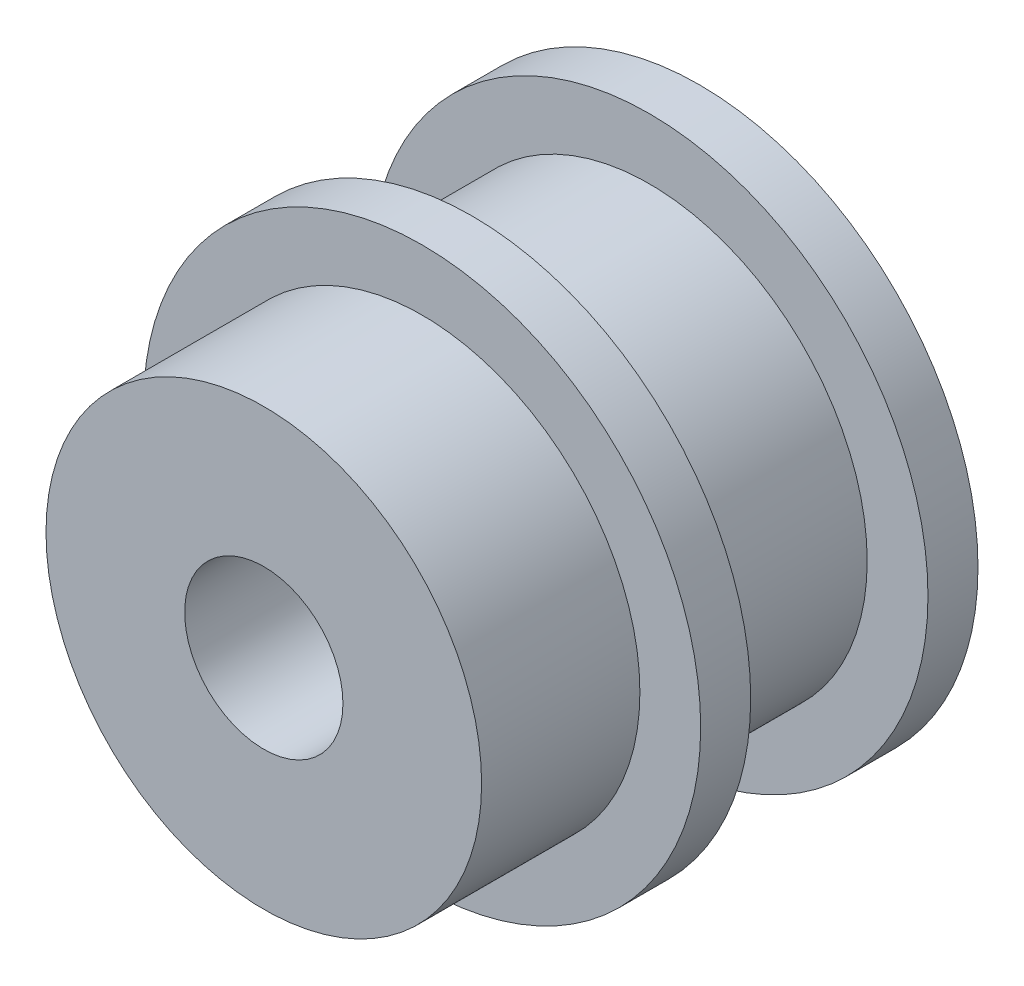
ISO-10303-21;
HEADER;
FILE_DESCRIPTION(('STEP AP214'),'2;1');
FILE_NAME('part.step','',(''),(''),'','','');
FILE_SCHEMA(('AUTOMOTIVE_DESIGN { 1 0 10303 214 1 1 1 1 }'));
ENDSEC;
DATA;
#1=APPLICATION_CONTEXT('core data for automotive mechanical design processes');
#2=APPLICATION_PROTOCOL_DEFINITION('international standard','automotive_design',2000,#1);
#3=PRODUCT_CONTEXT('',#1,'mechanical');
#4=PRODUCT('Part','Part','',(#3));
#5=PRODUCT_RELATED_PRODUCT_CATEGORY('part','',(#4));
#6=PRODUCT_DEFINITION_FORMATION('','',#4);
#7=PRODUCT_DEFINITION_CONTEXT('part definition',#1,'design');
#8=PRODUCT_DEFINITION('design','',#6,#7);
#9=PRODUCT_DEFINITION_SHAPE('','',#8);
#10=(LENGTH_UNIT() NAMED_UNIT(*) SI_UNIT(.MILLI.,.METRE.));
#11=(NAMED_UNIT(*) PLANE_ANGLE_UNIT() SI_UNIT($,.RADIAN.));
#12=(NAMED_UNIT(*) SI_UNIT($,.STERADIAN.) SOLID_ANGLE_UNIT());
#13=UNCERTAINTY_MEASURE_WITH_UNIT(LENGTH_MEASURE(1.E-05),#10,'distance_accuracy_value','');
#14=(GEOMETRIC_REPRESENTATION_CONTEXT(3) GLOBAL_UNCERTAINTY_ASSIGNED_CONTEXT((#13)) GLOBAL_UNIT_ASSIGNED_CONTEXT((#10,
#11,#12)) REPRESENTATION_CONTEXT('',''));
#15=CARTESIAN_POINT('',(0.,0.,0.));
#16=DIRECTION('',(0.,0.,1.));
#17=DIRECTION('',(1.,0.,0.));
#18=AXIS2_PLACEMENT_3D('',#15,#16,#17);
#19=CARTESIAN_POINT('',(0.,0.,0.));
#20=DIRECTION('',(0.,0.,1.));
#21=DIRECTION('',(1.,0.,0.));
#22=AXIS2_PLACEMENT_3D('',#19,#20,#21);
#23=PLANE('',#22);
#24=CARTESIAN_POINT('',(0.,0.,0.));
#25=DIRECTION('',(0.,0.,1.));
#26=DIRECTION('',(1.,0.,0.));
#27=AXIS2_PLACEMENT_3D('',#24,#25,#26);
#28=CIRCLE('',#27,8.7376);
#29=CARTESIAN_POINT('',(8.7376,0.,0.));
#30=VERTEX_POINT('',#29);
#31=EDGE_CURVE('E65',#30,#30,#28,.T.);
#32=ORIENTED_EDGE('',*,*,#31,.T.);
#33=EDGE_LOOP('',(#32));
#34=FACE_BOUND('',#33,.T.);
#35=CARTESIAN_POINT('',(0.,0.,0.));
#36=DIRECTION('',(0.,0.,1.));
#37=DIRECTION('',(1.,0.,0.));
#38=AXIS2_PLACEMENT_3D('',#35,#36,#37);
#39=CIRCLE('',#38,3.175);
#40=CARTESIAN_POINT('',(3.175,0.,0.));
#41=VERTEX_POINT('',#40);
#42=EDGE_CURVE('E10',#41,#41,#39,.T.);
#43=ORIENTED_EDGE('',*,*,#42,.F.);
#44=EDGE_LOOP('',(#43));
#45=FACE_BOUND('',#44,.T.);
#46=ADVANCED_FACE('F31',(#34,#45),#23,.T.);
#47=CARTESIAN_POINT('',(0.,0.,0.));
#48=DIRECTION('',(0.,0.,1.));
#49=DIRECTION('',(1.,0.,0.));
#50=AXIS2_PLACEMENT_3D('',#47,#48,#49);
#51=CYLINDRICAL_SURFACE('',#50,3.175);
#52=CARTESIAN_POINT('',(0.,0.,-17.4752));
#53=DIRECTION('',(0.,0.,1.));
#54=DIRECTION('',(1.,0.,0.));
#55=AXIS2_PLACEMENT_3D('',#52,#53,#54);
#56=CIRCLE('',#55,3.175);
#57=CARTESIAN_POINT('',(3.175,0.,-17.4752));
#58=VERTEX_POINT('',#57);
#59=EDGE_CURVE('E37',#58,#58,#56,.T.);
#60=ORIENTED_EDGE('',*,*,#59,.F.);
#61=EDGE_LOOP('',(#60));
#62=FACE_BOUND('',#61,.T.);
#63=ORIENTED_EDGE('',*,*,#42,.T.);
#64=EDGE_LOOP('',(#63));
#65=FACE_BOUND('',#64,.T.);
#66=ADVANCED_FACE('F83',(#62,#65),#51,.F.);
#67=CARTESIAN_POINT('',(0.,0.,-17.4752));
#68=DIRECTION('',(0.,0.,-1.));
#69=DIRECTION('',(-1.,0.,0.));
#70=AXIS2_PLACEMENT_3D('',#67,#68,#69);
#71=PLANE('',#70);
#72=ORIENTED_EDGE('',*,*,#59,.T.);
#73=EDGE_LOOP('',(#72));
#74=FACE_BOUND('',#73,.T.);
#75=CARTESIAN_POINT('',(0.,0.,-17.4752));
#76=DIRECTION('',(0.,0.,1.));
#77=DIRECTION('',(1.,0.,0.));
#78=AXIS2_PLACEMENT_3D('',#75,#76,#77);
#79=CIRCLE('',#78,11.176);
#80=CARTESIAN_POINT('',(11.176,0.,-17.4752));
#81=VERTEX_POINT('',#80);
#82=EDGE_CURVE('E41',#81,#81,#79,.T.);
#83=ORIENTED_EDGE('',*,*,#82,.F.);
#84=EDGE_LOOP('',(#83));
#85=FACE_BOUND('',#84,.T.);
#86=ADVANCED_FACE('F87',(#74,#85),#71,.T.);
#87=CARTESIAN_POINT('',(0.,0.,0.));
#88=DIRECTION('',(0.,0.,1.));
#89=DIRECTION('',(1.,0.,0.));
#90=AXIS2_PLACEMENT_3D('',#87,#88,#89);
#91=CYLINDRICAL_SURFACE('',#90,11.176);
#92=ORIENTED_EDGE('',*,*,#82,.T.);
#93=EDGE_LOOP('',(#92));
#94=FACE_BOUND('',#93,.T.);
#95=CARTESIAN_POINT('',(0.,0.,-15.4686));
#96=DIRECTION('',(0.,0.,1.));
#97=DIRECTION('',(1.,0.,0.));
#98=AXIS2_PLACEMENT_3D('',#95,#96,#97);
#99=CIRCLE('',#98,11.176);
#100=CARTESIAN_POINT('',(11.176,0.,-15.4686));
#101=VERTEX_POINT('',#100);
#102=EDGE_CURVE('E45',#101,#101,#99,.T.);
#103=ORIENTED_EDGE('',*,*,#102,.F.);
#104=EDGE_LOOP('',(#103));
#105=FACE_BOUND('',#104,.T.);
#106=ADVANCED_FACE('F92',(#94,#105),#91,.T.);
#107=CARTESIAN_POINT('',(0.,0.,-15.4686));
#108=DIRECTION('',(0.,0.,1.));
#109=DIRECTION('',(1.,0.,0.));
#110=AXIS2_PLACEMENT_3D('',#107,#108,#109);
#111=PLANE('',#110);
#112=ORIENTED_EDGE('',*,*,#102,.T.);
#113=EDGE_LOOP('',(#112));
#114=FACE_BOUND('',#113,.T.);
#115=CARTESIAN_POINT('',(0.,0.,-15.4686));
#116=DIRECTION('',(0.,0.,1.));
#117=DIRECTION('',(1.,0.,0.));
#118=AXIS2_PLACEMENT_3D('',#115,#116,#117);
#119=CIRCLE('',#118,8.7376);
#120=CARTESIAN_POINT('',(8.7376,0.,-15.4686));
#121=VERTEX_POINT('',#120);
#122=EDGE_CURVE('E50',#121,#121,#119,.T.);
#123=ORIENTED_EDGE('',*,*,#122,.F.);
#124=EDGE_LOOP('',(#123));
#125=FACE_BOUND('',#124,.T.);
#126=ADVANCED_FACE('F97',(#114,#125),#111,.T.);
#127=CARTESIAN_POINT('',(0.,0.,0.));
#128=DIRECTION('',(0.,0.,1.));
#129=DIRECTION('',(1.,0.,0.));
#130=AXIS2_PLACEMENT_3D('',#127,#128,#129);
#131=CYLINDRICAL_SURFACE('',#130,8.7376);
#132=ORIENTED_EDGE('',*,*,#122,.T.);
#133=EDGE_LOOP('',(#132));
#134=FACE_BOUND('',#133,.T.);
#135=CARTESIAN_POINT('',(0.,0.,-8.3566));
#136=DIRECTION('',(0.,0.,1.));
#137=DIRECTION('',(1.,0.,0.));
#138=AXIS2_PLACEMENT_3D('',#135,#136,#137);
#139=CIRCLE('',#138,8.7376);
#140=CARTESIAN_POINT('',(8.7376,0.,-8.3566));
#141=VERTEX_POINT('',#140);
#142=EDGE_CURVE('E53',#141,#141,#139,.T.);
#143=ORIENTED_EDGE('',*,*,#142,.F.);
#144=EDGE_LOOP('',(#143));
#145=FACE_BOUND('',#144,.T.);
#146=ADVANCED_FACE('F101',(#134,#145),#131,.T.);
#147=CARTESIAN_POINT('',(0.,0.,-8.3566));
#148=DIRECTION('',(0.,0.,-1.));
#149=DIRECTION('',(-1.,0.,0.));
#150=AXIS2_PLACEMENT_3D('',#147,#148,#149);
#151=PLANE('',#150);
#152=ORIENTED_EDGE('',*,*,#142,.T.);
#153=EDGE_LOOP('',(#152));
#154=FACE_BOUND('',#153,.T.);
#155=CARTESIAN_POINT('',(0.,0.,-8.3566));
#156=DIRECTION('',(0.,0.,1.));
#157=DIRECTION('',(1.,0.,0.));
#158=AXIS2_PLACEMENT_3D('',#155,#156,#157);
#159=CIRCLE('',#158,11.176);
#160=CARTESIAN_POINT('',(11.176,0.,-8.3566));
#161=VERTEX_POINT('',#160);
#162=EDGE_CURVE('E56',#161,#161,#159,.T.);
#163=ORIENTED_EDGE('',*,*,#162,.F.);
#164=EDGE_LOOP('',(#163));
#165=FACE_BOUND('',#164,.T.);
#166=ADVANCED_FACE('F105',(#154,#165),#151,.T.);
#167=CARTESIAN_POINT('',(0.,0.,0.));
#168=DIRECTION('',(0.,0.,1.));
#169=DIRECTION('',(1.,0.,0.));
#170=AXIS2_PLACEMENT_3D('',#167,#168,#169);
#171=CYLINDRICAL_SURFACE('',#170,11.176);
#172=ORIENTED_EDGE('',*,*,#162,.T.);
#173=EDGE_LOOP('',(#172));
#174=FACE_BOUND('',#173,.T.);
#175=CARTESIAN_POINT('',(0.,0.,-6.35));
#176=DIRECTION('',(0.,0.,1.));
#177=DIRECTION('',(1.,0.,0.));
#178=AXIS2_PLACEMENT_3D('',#175,#176,#177);
#179=CIRCLE('',#178,11.176);
#180=CARTESIAN_POINT('',(11.176,0.,-6.35));
#181=VERTEX_POINT('',#180);
#182=EDGE_CURVE('E59',#181,#181,#179,.T.);
#183=ORIENTED_EDGE('',*,*,#182,.F.);
#184=EDGE_LOOP('',(#183));
#185=FACE_BOUND('',#184,.T.);
#186=ADVANCED_FACE('F79',(#174,#185),#171,.T.);
#187=CARTESIAN_POINT('',(0.,0.,-6.35));
#188=DIRECTION('',(0.,0.,1.));
#189=DIRECTION('',(1.,0.,0.));
#190=AXIS2_PLACEMENT_3D('',#187,#188,#189);
#191=PLANE('',#190);
#192=ORIENTED_EDGE('',*,*,#182,.T.);
#193=EDGE_LOOP('',(#192));
#194=FACE_BOUND('',#193,.T.);
#195=CARTESIAN_POINT('',(0.,0.,-6.35));
#196=DIRECTION('',(0.,0.,1.));
#197=DIRECTION('',(1.,0.,0.));
#198=AXIS2_PLACEMENT_3D('',#195,#196,#197);
#199=CIRCLE('',#198,8.7376);
#200=CARTESIAN_POINT('',(8.7376,0.,-6.35));
#201=VERTEX_POINT('',#200);
#202=EDGE_CURVE('E62',#201,#201,#199,.T.);
#203=ORIENTED_EDGE('',*,*,#202,.F.);
#204=EDGE_LOOP('',(#203));
#205=FACE_BOUND('',#204,.T.);
#206=ADVANCED_FACE('F73',(#194,#205),#191,.T.);
#207=CARTESIAN_POINT('',(0.,0.,0.));
#208=DIRECTION('',(0.,0.,1.));
#209=DIRECTION('',(1.,0.,0.));
#210=AXIS2_PLACEMENT_3D('',#207,#208,#209);
#211=CYLINDRICAL_SURFACE('',#210,8.7376);
#212=ORIENTED_EDGE('',*,*,#202,.T.);
#213=EDGE_LOOP('',(#212));
#214=FACE_BOUND('',#213,.T.);
#215=ORIENTED_EDGE('',*,*,#31,.F.);
#216=EDGE_LOOP('',(#215));
#217=FACE_BOUND('',#216,.T.);
#218=ADVANCED_FACE('F71',(#214,#217),#211,.T.);
#219=CLOSED_SHELL('',(#46,#66,#86,#106,#126,#146,#166,#186,#206,#218));
#220=MANIFOLD_SOLID_BREP('B2',#219);
#221=ADVANCED_BREP_SHAPE_REPRESENTATION('',(#18,#220),#14);
#222=SHAPE_DEFINITION_REPRESENTATION(#9,#221);
ENDSEC;
END-ISO-10303-21;
